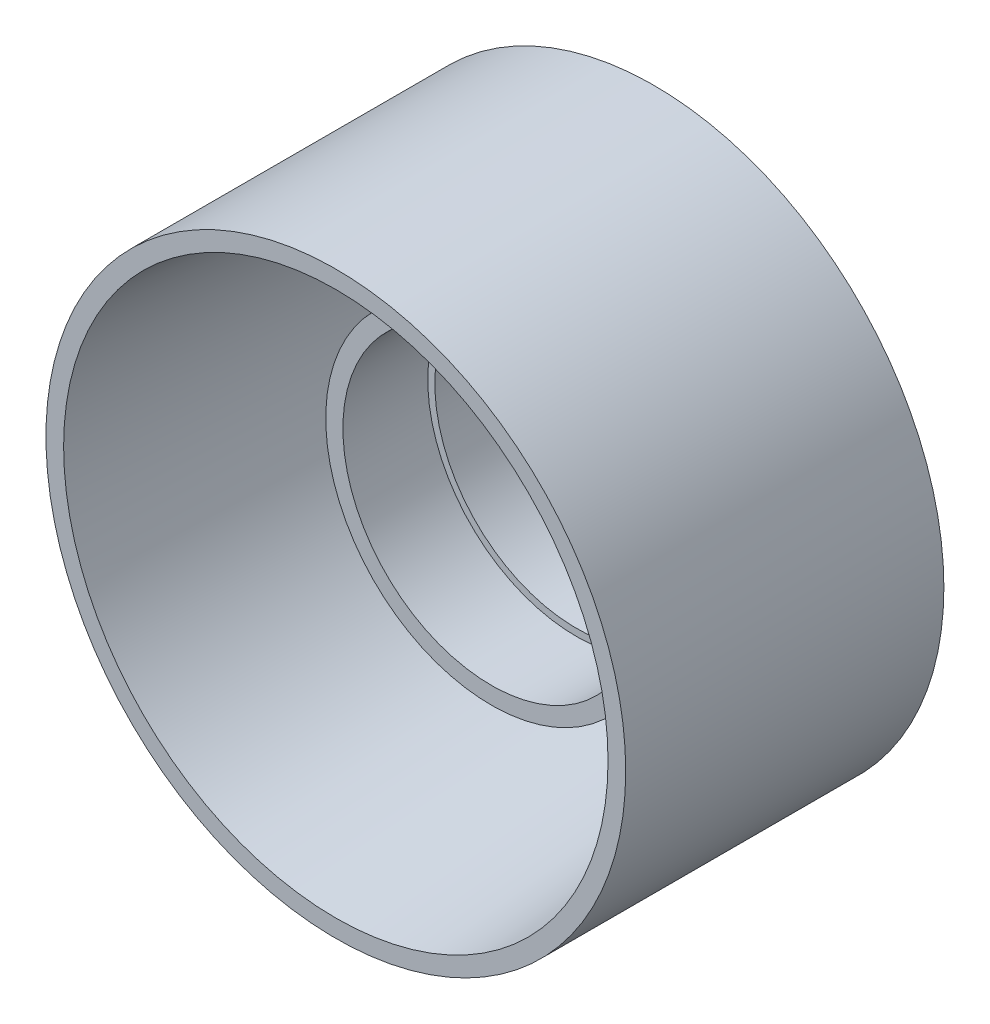
ISO-10303-21;
HEADER;
FILE_DESCRIPTION(('STEP AP214'),'2;1');
FILE_NAME('part.step','',(''),(''),'','','');
FILE_SCHEMA(('AUTOMOTIVE_DESIGN { 1 0 10303 214 1 1 1 1 }'));
ENDSEC;
DATA;
#1=APPLICATION_CONTEXT('core data for automotive mechanical design processes');
#2=APPLICATION_PROTOCOL_DEFINITION('international standard','automotive_design',2000,#1);
#3=PRODUCT_CONTEXT('',#1,'mechanical');
#4=PRODUCT('Part','Part','',(#3));
#5=PRODUCT_RELATED_PRODUCT_CATEGORY('part','',(#4));
#6=PRODUCT_DEFINITION_FORMATION('','',#4);
#7=PRODUCT_DEFINITION_CONTEXT('part definition',#1,'design');
#8=PRODUCT_DEFINITION('design','',#6,#7);
#9=PRODUCT_DEFINITION_SHAPE('','',#8);
#10=(LENGTH_UNIT() NAMED_UNIT(*) SI_UNIT(.MILLI.,.METRE.));
#11=(NAMED_UNIT(*) PLANE_ANGLE_UNIT() SI_UNIT($,.RADIAN.));
#12=(NAMED_UNIT(*) SI_UNIT($,.STERADIAN.) SOLID_ANGLE_UNIT());
#13=UNCERTAINTY_MEASURE_WITH_UNIT(LENGTH_MEASURE(1.E-05),#10,'distance_accuracy_value','');
#14=(GEOMETRIC_REPRESENTATION_CONTEXT(3) GLOBAL_UNCERTAINTY_ASSIGNED_CONTEXT((#13)) GLOBAL_UNIT_ASSIGNED_CONTEXT((#10,
#11,#12)) REPRESENTATION_CONTEXT('',''));
#15=CARTESIAN_POINT('',(0.,0.,0.));
#16=DIRECTION('',(0.,0.,1.));
#17=DIRECTION('',(1.,0.,0.));
#18=AXIS2_PLACEMENT_3D('',#15,#16,#17);
#19=CARTESIAN_POINT('',(0.,0.,5.));
#20=DIRECTION('',(0.,0.,1.));
#21=DIRECTION('',(1.,0.,0.));
#22=AXIS2_PLACEMENT_3D('',#19,#20,#21);
#23=PLANE('',#22);
#24=CARTESIAN_POINT('',(0.,0.,5.));
#25=DIRECTION('',(0.,0.,1.));
#26=DIRECTION('',(1.,0.,0.));
#27=AXIS2_PLACEMENT_3D('',#24,#25,#26);
#28=CIRCLE('',#27,35.0004534589631);
#29=CARTESIAN_POINT('',(35.0004534589631,0.,5.));
#30=VERTEX_POINT('',#29);
#31=EDGE_CURVE('E25',#30,#30,#28,.T.);
#32=ORIENTED_EDGE('',*,*,#31,.T.);
#33=EDGE_LOOP('',(#32));
#34=FACE_BOUND('',#33,.T.);
#35=CARTESIAN_POINT('',(0.,0.,5.));
#36=DIRECTION('',(0.,0.,1.));
#37=DIRECTION('',(1.,0.,0.));
#38=AXIS2_PLACEMENT_3D('',#35,#36,#37);
#39=CIRCLE('',#38,25.);
#40=CARTESIAN_POINT('',(25.,0.,5.));
#41=VERTEX_POINT('',#40);
#42=EDGE_CURVE('E37',#41,#41,#39,.T.);
#43=ORIENTED_EDGE('',*,*,#42,.F.);
#44=EDGE_LOOP('',(#43));
#45=FACE_BOUND('',#44,.T.);
#46=ADVANCED_FACE('F14',(#34,#45),#23,.T.);
#47=CARTESIAN_POINT('',(0.,0.,45.));
#48=DIRECTION('',(0.,0.,-1.));
#49=DIRECTION('',(-1.,0.,0.));
#50=AXIS2_PLACEMENT_3D('',#47,#48,#49);
#51=CYLINDRICAL_SURFACE('',#50,41.);
#52=CARTESIAN_POINT('',(0.,0.,45.));
#53=DIRECTION('',(0.,0.,1.));
#54=DIRECTION('',(1.,0.,0.));
#55=AXIS2_PLACEMENT_3D('',#52,#53,#54);
#56=CIRCLE('',#55,41.);
#57=CARTESIAN_POINT('',(41.,0.,45.));
#58=VERTEX_POINT('',#57);
#59=EDGE_CURVE('E10',#58,#58,#56,.T.);
#60=ORIENTED_EDGE('',*,*,#59,.F.);
#61=EDGE_LOOP('',(#60));
#62=FACE_BOUND('',#61,.T.);
#63=CARTESIAN_POINT('',(0.,0.,0.));
#64=DIRECTION('',(0.,0.,1.));
#65=DIRECTION('',(1.,0.,0.));
#66=AXIS2_PLACEMENT_3D('',#63,#64,#65);
#67=CIRCLE('',#66,41.);
#68=CARTESIAN_POINT('',(41.,0.,0.));
#69=VERTEX_POINT('',#68);
#70=EDGE_CURVE('E21',#69,#69,#67,.T.);
#71=ORIENTED_EDGE('',*,*,#70,.T.);
#72=EDGE_LOOP('',(#71));
#73=FACE_BOUND('',#72,.T.);
#74=ADVANCED_FACE('F16',(#62,#73),#51,.T.);
#75=CARTESIAN_POINT('',(0.,0.,45.));
#76=DIRECTION('',(0.,0.,1.));
#77=DIRECTION('',(1.,0.,0.));
#78=AXIS2_PLACEMENT_3D('',#75,#76,#77);
#79=PLANE('',#78);
#80=CARTESIAN_POINT('',(0.,0.,45.));
#81=DIRECTION('',(0.,0.,1.));
#82=DIRECTION('',(1.,0.,0.));
#83=AXIS2_PLACEMENT_3D('',#80,#81,#82);
#84=CIRCLE('',#83,38.5);
#85=CARTESIAN_POINT('',(38.5,0.,45.));
#86=VERTEX_POINT('',#85);
#87=EDGE_CURVE('E29',#86,#86,#84,.T.);
#88=ORIENTED_EDGE('',*,*,#87,.F.);
#89=EDGE_LOOP('',(#88));
#90=FACE_BOUND('',#89,.T.);
#91=ORIENTED_EDGE('',*,*,#59,.T.);
#92=EDGE_LOOP('',(#91));
#93=FACE_BOUND('',#92,.T.);
#94=ADVANCED_FACE('F105',(#90,#93),#79,.T.);
#95=CARTESIAN_POINT('',(0.,0.,0.));
#96=DIRECTION('',(0.,0.,1.));
#97=DIRECTION('',(1.,0.,0.));
#98=AXIS2_PLACEMENT_3D('',#95,#96,#97);
#99=PLANE('',#98);
#100=CARTESIAN_POINT('',(0.,0.,0.));
#101=DIRECTION('',(0.,0.,1.));
#102=DIRECTION('',(1.,0.,0.));
#103=AXIS2_PLACEMENT_3D('',#100,#101,#102);
#104=CIRCLE('',#103,15.5);
#105=CARTESIAN_POINT('',(15.5,0.,0.));
#106=VERTEX_POINT('',#105);
#107=EDGE_CURVE('E52',#106,#106,#104,.T.);
#108=ORIENTED_EDGE('',*,*,#107,.T.);
#109=EDGE_LOOP('',(#108));
#110=FACE_BOUND('',#109,.T.);
#111=ORIENTED_EDGE('',*,*,#70,.F.);
#112=EDGE_LOOP('',(#111));
#113=FACE_BOUND('',#112,.T.);
#114=ADVANCED_FACE('F110',(#110,#113),#99,.F.);
#115=CARTESIAN_POINT('',(0.,0.,45.));
#116=DIRECTION('',(0.,0.,1.));
#117=DIRECTION('',(1.,0.,0.));
#118=AXIS2_PLACEMENT_3D('',#115,#116,#117);
#119=CONICAL_SURFACE('',#118,38.5,0.0872664625997167);
#120=ORIENTED_EDGE('',*,*,#31,.F.);
#121=EDGE_LOOP('',(#120));
#122=FACE_BOUND('',#121,.T.);
#123=ORIENTED_EDGE('',*,*,#87,.T.);
#124=EDGE_LOOP('',(#123));
#125=FACE_BOUND('',#124,.T.);
#126=ADVANCED_FACE('F94',(#122,#125),#119,.F.);
#127=CARTESIAN_POINT('',(0.,0.,5.));
#128=DIRECTION('',(0.,0.,-1.));
#129=DIRECTION('',(1.,0.,0.));
#130=AXIS2_PLACEMENT_3D('',#127,#128,#129);
#131=CONICAL_SURFACE('',#130,25.,0.0872664625997167);
#132=CARTESIAN_POINT('',(0.,0.,23.));
#133=DIRECTION('',(0.,0.,1.));
#134=DIRECTION('',(1.,0.,0.));
#135=AXIS2_PLACEMENT_3D('',#132,#133,#134);
#136=CIRCLE('',#135,23.4252040565334);
#137=CARTESIAN_POINT('',(23.4252040565334,0.,23.));
#138=VERTEX_POINT('',#137);
#139=EDGE_CURVE('E34',#138,#138,#136,.T.);
#140=ORIENTED_EDGE('',*,*,#139,.F.);
#141=EDGE_LOOP('',(#140));
#142=FACE_BOUND('',#141,.T.);
#143=ORIENTED_EDGE('',*,*,#42,.T.);
#144=EDGE_LOOP('',(#143));
#145=FACE_BOUND('',#144,.T.);
#146=ADVANCED_FACE('F88',(#142,#145),#131,.T.);
#147=CARTESIAN_POINT('',(0.,0.,23.));
#148=DIRECTION('',(0.,0.,1.));
#149=DIRECTION('',(1.,0.,0.));
#150=AXIS2_PLACEMENT_3D('',#147,#148,#149);
#151=PLANE('',#150);
#152=CARTESIAN_POINT('',(0.,0.,23.));
#153=DIRECTION('',(0.,0.,1.));
#154=DIRECTION('',(1.,0.,0.));
#155=AXIS2_PLACEMENT_3D('',#152,#153,#154);
#156=CIRCLE('',#155,21.);
#157=CARTESIAN_POINT('',(21.,0.,23.));
#158=VERTEX_POINT('',#157);
#159=EDGE_CURVE('E43',#158,#158,#156,.T.);
#160=ORIENTED_EDGE('',*,*,#159,.F.);
#161=EDGE_LOOP('',(#160));
#162=FACE_BOUND('',#161,.T.);
#163=ORIENTED_EDGE('',*,*,#139,.T.);
#164=EDGE_LOOP('',(#163));
#165=FACE_BOUND('',#164,.T.);
#166=ADVANCED_FACE('F82',(#162,#165),#151,.T.);
#167=CARTESIAN_POINT('',(0.,0.,11.));
#168=DIRECTION('',(0.,0.,1.));
#169=DIRECTION('',(1.,0.,0.));
#170=AXIS2_PLACEMENT_3D('',#167,#168,#169);
#171=CYLINDRICAL_SURFACE('',#170,21.);
#172=CARTESIAN_POINT('',(0.,0.,11.));
#173=DIRECTION('',(0.,0.,1.));
#174=DIRECTION('',(1.,0.,0.));
#175=AXIS2_PLACEMENT_3D('',#172,#173,#174);
#176=CIRCLE('',#175,21.);
#177=CARTESIAN_POINT('',(21.,0.,11.));
#178=VERTEX_POINT('',#177);
#179=EDGE_CURVE('E40',#178,#178,#176,.T.);
#180=ORIENTED_EDGE('',*,*,#179,.F.);
#181=EDGE_LOOP('',(#180));
#182=FACE_BOUND('',#181,.T.);
#183=ORIENTED_EDGE('',*,*,#159,.T.);
#184=EDGE_LOOP('',(#183));
#185=FACE_BOUND('',#184,.T.);
#186=ADVANCED_FACE('F76',(#182,#185),#171,.F.);
#187=CARTESIAN_POINT('',(0.,0.,11.));
#188=DIRECTION('',(0.,0.,1.));
#189=DIRECTION('',(1.,0.,0.));
#190=AXIS2_PLACEMENT_3D('',#187,#188,#189);
#191=PLANE('',#190);
#192=CARTESIAN_POINT('',(0.,0.,11.));
#193=DIRECTION('',(0.,0.,1.));
#194=DIRECTION('',(1.,0.,0.));
#195=AXIS2_PLACEMENT_3D('',#192,#193,#194);
#196=CIRCLE('',#195,20.);
#197=CARTESIAN_POINT('',(20.,0.,11.));
#198=VERTEX_POINT('',#197);
#199=EDGE_CURVE('E49',#198,#198,#196,.T.);
#200=ORIENTED_EDGE('',*,*,#199,.F.);
#201=EDGE_LOOP('',(#200));
#202=FACE_BOUND('',#201,.T.);
#203=ORIENTED_EDGE('',*,*,#179,.T.);
#204=EDGE_LOOP('',(#203));
#205=FACE_BOUND('',#204,.T.);
#206=ADVANCED_FACE('F70',(#202,#205),#191,.T.);
#207=CARTESIAN_POINT('',(0.,0.,1.));
#208=DIRECTION('',(0.,0.,1.));
#209=DIRECTION('',(1.,0.,0.));
#210=AXIS2_PLACEMENT_3D('',#207,#208,#209);
#211=CYLINDRICAL_SURFACE('',#210,20.);
#212=CARTESIAN_POINT('',(0.,0.,1.));
#213=DIRECTION('',(0.,0.,1.));
#214=DIRECTION('',(1.,0.,0.));
#215=AXIS2_PLACEMENT_3D('',#212,#213,#214);
#216=CIRCLE('',#215,20.);
#217=CARTESIAN_POINT('',(20.,0.,1.));
#218=VERTEX_POINT('',#217);
#219=EDGE_CURVE('E46',#218,#218,#216,.T.);
#220=ORIENTED_EDGE('',*,*,#219,.F.);
#221=EDGE_LOOP('',(#220));
#222=FACE_BOUND('',#221,.T.);
#223=ORIENTED_EDGE('',*,*,#199,.T.);
#224=EDGE_LOOP('',(#223));
#225=FACE_BOUND('',#224,.T.);
#226=ADVANCED_FACE('F64',(#222,#225),#211,.F.);
#227=CARTESIAN_POINT('',(0.,0.,1.));
#228=DIRECTION('',(0.,0.,1.));
#229=DIRECTION('',(1.,0.,0.));
#230=AXIS2_PLACEMENT_3D('',#227,#228,#229);
#231=PLANE('',#230);
#232=CARTESIAN_POINT('',(0.,0.,1.));
#233=DIRECTION('',(0.,0.,1.));
#234=DIRECTION('',(1.,0.,0.));
#235=AXIS2_PLACEMENT_3D('',#232,#233,#234);
#236=CIRCLE('',#235,15.5);
#237=CARTESIAN_POINT('',(15.5,0.,1.));
#238=VERTEX_POINT('',#237);
#239=EDGE_CURVE('E55',#238,#238,#236,.T.);
#240=ORIENTED_EDGE('',*,*,#239,.F.);
#241=EDGE_LOOP('',(#240));
#242=FACE_BOUND('',#241,.T.);
#243=ORIENTED_EDGE('',*,*,#219,.T.);
#244=EDGE_LOOP('',(#243));
#245=FACE_BOUND('',#244,.T.);
#246=ADVANCED_FACE('F61',(#242,#245),#231,.T.);
#247=CARTESIAN_POINT('',(0.,0.,0.));
#248=DIRECTION('',(0.,0.,1.));
#249=DIRECTION('',(1.,0.,0.));
#250=AXIS2_PLACEMENT_3D('',#247,#248,#249);
#251=CYLINDRICAL_SURFACE('',#250,15.5);
#252=ORIENTED_EDGE('',*,*,#107,.F.);
#253=EDGE_LOOP('',(#252));
#254=FACE_BOUND('',#253,.T.);
#255=ORIENTED_EDGE('',*,*,#239,.T.);
#256=EDGE_LOOP('',(#255));
#257=FACE_BOUND('',#256,.T.);
#258=ADVANCED_FACE('F59',(#254,#257),#251,.F.);
#259=CLOSED_SHELL('',(#46,#74,#94,#114,#126,#146,#166,#186,#206,#226,#246,#258));
#260=MANIFOLD_SOLID_BREP('B1',#259);
#261=ADVANCED_BREP_SHAPE_REPRESENTATION('',(#18,#260),#14);
#262=SHAPE_DEFINITION_REPRESENTATION(#9,#261);
ENDSEC;
END-ISO-10303-21;
